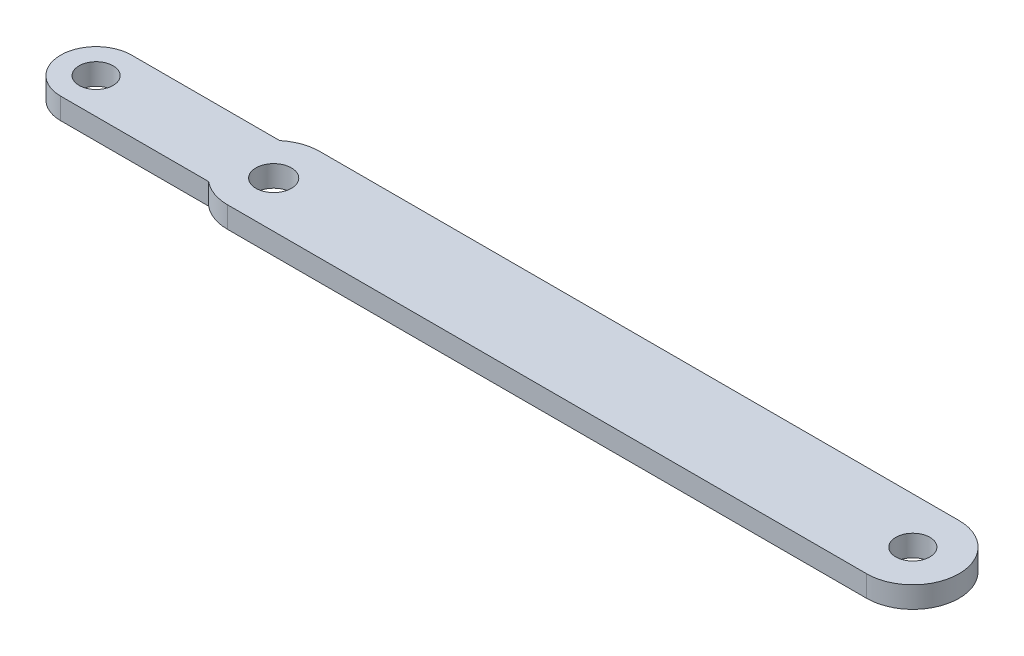
ISO-10303-21;
HEADER;
FILE_DESCRIPTION(('STEP AP214'),'2;1');
FILE_NAME('part.step','',(''),(''),'','','');
FILE_SCHEMA(('AUTOMOTIVE_DESIGN { 1 0 10303 214 1 1 1 1 }'));
ENDSEC;
DATA;
#1=APPLICATION_CONTEXT('core data for automotive mechanical design processes');
#2=APPLICATION_PROTOCOL_DEFINITION('international standard','automotive_design',2000,#1);
#3=PRODUCT_CONTEXT('',#1,'mechanical');
#4=PRODUCT('Part','Part','',(#3));
#5=PRODUCT_RELATED_PRODUCT_CATEGORY('part','',(#4));
#6=PRODUCT_DEFINITION_FORMATION('','',#4);
#7=PRODUCT_DEFINITION_CONTEXT('part definition',#1,'design');
#8=PRODUCT_DEFINITION('design','',#6,#7);
#9=PRODUCT_DEFINITION_SHAPE('','',#8);
#10=(LENGTH_UNIT() NAMED_UNIT(*) SI_UNIT(.MILLI.,.METRE.));
#11=(NAMED_UNIT(*) PLANE_ANGLE_UNIT() SI_UNIT($,.RADIAN.));
#12=(NAMED_UNIT(*) SI_UNIT($,.STERADIAN.) SOLID_ANGLE_UNIT());
#13=UNCERTAINTY_MEASURE_WITH_UNIT(LENGTH_MEASURE(1.E-05),#10,'distance_accuracy_value','');
#14=(GEOMETRIC_REPRESENTATION_CONTEXT(3) GLOBAL_UNCERTAINTY_ASSIGNED_CONTEXT((#13)) GLOBAL_UNIT_ASSIGNED_CONTEXT((#10,
#11,#12)) REPRESENTATION_CONTEXT('',''));
#15=CARTESIAN_POINT('',(0.,0.,0.));
#16=DIRECTION('',(0.,0.,1.));
#17=DIRECTION('',(1.,0.,0.));
#18=AXIS2_PLACEMENT_3D('',#15,#16,#17);
#19=CARTESIAN_POINT('',(0.,3.,-197.318492307149));
#20=DIRECTION('',(0.,0.,1.));
#21=DIRECTION('',(1.,0.,0.));
#22=AXIS2_PLACEMENT_3D('',#19,#20,#21);
#23=PLANE('',#22);
#24=DIRECTION('',(-1.,0.,0.));
#25=VECTOR('',#24,1.);
#26=CARTESIAN_POINT('',(0.,0.,-197.318492307149));
#27=LINE('',#26,#25);
#28=CARTESIAN_POINT('',(-6.55968882687473,0.,-197.318492307149));
#29=VERTEX_POINT('',#28);
#30=CARTESIAN_POINT('',(-27.4063768954157,0.,-197.318492307149));
#31=VERTEX_POINT('',#30);
#32=EDGE_CURVE('E147',#29,#31,#27,.T.);
#33=ORIENTED_EDGE('',*,*,#32,.T.);
#34=DIRECTION('',(0.,-1.,0.));
#35=VECTOR('',#34,1.);
#36=CARTESIAN_POINT('',(-27.4063768954157,3.,-197.318492307149));
#37=LINE('',#36,#35);
#38=CARTESIAN_POINT('',(-27.4063768954157,3.,-197.318492307149));
#39=VERTEX_POINT('',#38);
#40=EDGE_CURVE('E11',#39,#31,#37,.T.);
#41=ORIENTED_EDGE('',*,*,#40,.F.);
#42=DIRECTION('',(-1.,0.,0.));
#43=VECTOR('',#42,1.);
#44=CARTESIAN_POINT('',(0.,3.,-197.318492307149));
#45=LINE('',#44,#43);
#46=CARTESIAN_POINT('',(-6.55968882687473,3.,-197.318492307149));
#47=VERTEX_POINT('',#46);
#48=EDGE_CURVE('E201',#47,#39,#45,.T.);
#49=ORIENTED_EDGE('',*,*,#48,.F.);
#50=DIRECTION('',(0.,-1.,0.));
#51=VECTOR('',#50,1.);
#52=CARTESIAN_POINT('',(-6.55968882687473,3.,-197.318492307149));
#53=LINE('',#52,#51);
#54=EDGE_CURVE('E143',#47,#29,#53,.T.);
#55=ORIENTED_EDGE('',*,*,#54,.T.);
#56=EDGE_LOOP('',(#33,#41,#49,#55));
#57=FACE_BOUND('',#56,.T.);
#58=ADVANCED_FACE('F41',(#57),#23,.F.);
#59=CARTESIAN_POINT('',(-27.4063768954157,3.,-192.318492307149));
#60=DIRECTION('',(0.,-1.,0.));
#61=DIRECTION('',(0.,0.,-1.));
#62=AXIS2_PLACEMENT_3D('',#59,#60,#61);
#63=CYLINDRICAL_SURFACE('',#62,5.);
#64=CARTESIAN_POINT('',(-27.4063768954157,0.,-192.318492307149));
#65=DIRECTION('',(0.,1.,0.));
#66=DIRECTION('',(0.,0.,1.));
#67=AXIS2_PLACEMENT_3D('',#64,#65,#66);
#68=CIRCLE('',#67,5.);
#69=CARTESIAN_POINT('',(-27.4063768954157,0.,-187.318492307149));
#70=VERTEX_POINT('',#69);
#71=EDGE_CURVE('E150',#31,#70,#68,.T.);
#72=ORIENTED_EDGE('',*,*,#71,.T.);
#73=DIRECTION('',(0.,-1.,0.));
#74=VECTOR('',#73,1.);
#75=CARTESIAN_POINT('',(-27.4063768954157,3.,-187.318492307149));
#76=LINE('',#75,#74);
#77=CARTESIAN_POINT('',(-27.4063768954157,3.,-187.318492307149));
#78=VERTEX_POINT('',#77);
#79=EDGE_CURVE('E50',#78,#70,#76,.T.);
#80=ORIENTED_EDGE('',*,*,#79,.F.);
#81=CARTESIAN_POINT('',(-27.4063768954157,3.,-192.318492307149));
#82=DIRECTION('',(0.,1.,0.));
#83=DIRECTION('',(0.,0.,1.));
#84=AXIS2_PLACEMENT_3D('',#81,#82,#83);
#85=CIRCLE('',#84,5.);
#86=EDGE_CURVE('E97',#39,#78,#85,.T.);
#87=ORIENTED_EDGE('',*,*,#86,.F.);
#88=ORIENTED_EDGE('',*,*,#40,.T.);
#89=EDGE_LOOP('',(#72,#80,#87,#88));
#90=FACE_BOUND('',#89,.T.);
#91=ADVANCED_FACE('F184',(#90),#63,.T.);
#92=CARTESIAN_POINT('',(0.,3.,-187.318492307149));
#93=DIRECTION('',(0.,0.,1.));
#94=DIRECTION('',(1.,0.,0.));
#95=AXIS2_PLACEMENT_3D('',#92,#93,#94);
#96=PLANE('',#95);
#97=DIRECTION('',(-1.,0.,0.));
#98=VECTOR('',#97,1.);
#99=CARTESIAN_POINT('',(0.,0.,-187.318492307149));
#100=LINE('',#99,#98);
#101=CARTESIAN_POINT('',(-6.55968882687473,0.,-187.318492307149));
#102=VERTEX_POINT('',#101);
#103=EDGE_CURVE('E153',#102,#70,#100,.T.);
#104=ORIENTED_EDGE('',*,*,#103,.F.);
#105=DIRECTION('',(0.,-1.,0.));
#106=VECTOR('',#105,1.);
#107=CARTESIAN_POINT('',(-6.55968882687473,3.,-187.318492307149));
#108=LINE('',#107,#106);
#109=CARTESIAN_POINT('',(-6.55968882687473,3.,-187.318492307149));
#110=VERTEX_POINT('',#109);
#111=EDGE_CURVE('E177',#110,#102,#108,.T.);
#112=ORIENTED_EDGE('',*,*,#111,.F.);
#113=DIRECTION('',(-1.,0.,0.));
#114=VECTOR('',#113,1.);
#115=CARTESIAN_POINT('',(0.,3.,-187.318492307149));
#116=LINE('',#115,#114);
#117=EDGE_CURVE('E183',#110,#78,#116,.T.);
#118=ORIENTED_EDGE('',*,*,#117,.T.);
#119=ORIENTED_EDGE('',*,*,#79,.T.);
#120=EDGE_LOOP('',(#104,#112,#118,#119));
#121=FACE_BOUND('',#120,.T.);
#122=ADVANCED_FACE('F181',(#121),#96,.T.);
#123=CARTESIAN_POINT('',(-2.40637689541569,3.,-192.318492307149));
#124=DIRECTION('',(0.,-1.,0.));
#125=DIRECTION('',(0.,0.,-1.));
#126=AXIS2_PLACEMENT_3D('',#123,#124,#125);
#127=CYLINDRICAL_SURFACE('',#126,6.50000000000001);
#128=CARTESIAN_POINT('',(-2.40637689541569,0.,-192.318492307149));
#129=DIRECTION('',(0.,1.,0.));
#130=DIRECTION('',(0.,0.,1.));
#131=AXIS2_PLACEMENT_3D('',#128,#129,#130);
#132=CIRCLE('',#131,6.50000000000001);
#133=CARTESIAN_POINT('',(-2.40637689541569,0.,-185.818492307149));
#134=VERTEX_POINT('',#133);
#135=EDGE_CURVE('E156',#102,#134,#132,.T.);
#136=ORIENTED_EDGE('',*,*,#135,.T.);
#137=DIRECTION('',(0.,-1.,0.));
#138=VECTOR('',#137,1.);
#139=CARTESIAN_POINT('',(-2.40637689541569,3.,-185.818492307149));
#140=LINE('',#139,#138);
#141=CARTESIAN_POINT('',(-2.40637689541569,3.,-185.818492307149));
#142=VERTEX_POINT('',#141);
#143=EDGE_CURVE('E174',#142,#134,#140,.T.);
#144=ORIENTED_EDGE('',*,*,#143,.F.);
#145=CARTESIAN_POINT('',(-2.40637689541569,3.,-192.318492307149));
#146=DIRECTION('',(0.,1.,0.));
#147=DIRECTION('',(0.,0.,1.));
#148=AXIS2_PLACEMENT_3D('',#145,#146,#147);
#149=CIRCLE('',#148,6.50000000000001);
#150=EDGE_CURVE('E135',#110,#142,#149,.T.);
#151=ORIENTED_EDGE('',*,*,#150,.F.);
#152=ORIENTED_EDGE('',*,*,#111,.T.);
#153=EDGE_LOOP('',(#136,#144,#151,#152));
#154=FACE_BOUND('',#153,.T.);
#155=ADVANCED_FACE('F194',(#154),#127,.T.);
#156=CARTESIAN_POINT('',(0.,3.,-185.818492307149));
#157=DIRECTION('',(0.,0.,-1.));
#158=DIRECTION('',(-1.,0.,0.));
#159=AXIS2_PLACEMENT_3D('',#156,#157,#158);
#160=PLANE('',#159);
#161=DIRECTION('',(1.,0.,0.));
#162=VECTOR('',#161,1.);
#163=CARTESIAN_POINT('',(0.,0.,-185.818492307149));
#164=LINE('',#163,#162);
#165=CARTESIAN_POINT('',(87.5936231045843,0.,-185.818492307149));
#166=VERTEX_POINT('',#165);
#167=EDGE_CURVE('E158',#134,#166,#164,.T.);
#168=ORIENTED_EDGE('',*,*,#167,.T.);
#169=DIRECTION('',(0.,-1.,0.));
#170=VECTOR('',#169,1.);
#171=CARTESIAN_POINT('',(87.5936231045843,3.,-185.818492307149));
#172=LINE('',#171,#170);
#173=CARTESIAN_POINT('',(87.5936231045843,3.,-185.818492307149));
#174=VERTEX_POINT('',#173);
#175=EDGE_CURVE('E122',#174,#166,#172,.T.);
#176=ORIENTED_EDGE('',*,*,#175,.F.);
#177=DIRECTION('',(1.,0.,0.));
#178=VECTOR('',#177,1.);
#179=CARTESIAN_POINT('',(0.,3.,-185.818492307149));
#180=LINE('',#179,#178);
#181=EDGE_CURVE('E128',#142,#174,#180,.T.);
#182=ORIENTED_EDGE('',*,*,#181,.F.);
#183=ORIENTED_EDGE('',*,*,#143,.T.);
#184=EDGE_LOOP('',(#168,#176,#182,#183));
#185=FACE_BOUND('',#184,.T.);
#186=ADVANCED_FACE('F197',(#185),#160,.F.);
#187=CARTESIAN_POINT('',(87.5936231045843,3.,-192.318492307149));
#188=DIRECTION('',(0.,-1.,0.));
#189=DIRECTION('',(0.,0.,-1.));
#190=AXIS2_PLACEMENT_3D('',#187,#188,#189);
#191=CYLINDRICAL_SURFACE('',#190,6.50000000000001);
#192=CARTESIAN_POINT('',(87.5936231045843,0.,-192.318492307149));
#193=DIRECTION('',(0.,1.,0.));
#194=DIRECTION('',(0.,0.,1.));
#195=AXIS2_PLACEMENT_3D('',#192,#193,#194);
#196=CIRCLE('',#195,6.50000000000001);
#197=CARTESIAN_POINT('',(87.5936231045843,0.,-198.818492307149));
#198=VERTEX_POINT('',#197);
#199=EDGE_CURVE('E117',#198,#166,#196,.F.);
#200=ORIENTED_EDGE('',*,*,#199,.F.);
#201=DIRECTION('',(0.,-1.,0.));
#202=VECTOR('',#201,1.);
#203=CARTESIAN_POINT('',(87.5936231045843,3.,-198.818492307149));
#204=LINE('',#203,#202);
#205=CARTESIAN_POINT('',(87.5936231045843,3.,-198.818492307149));
#206=VERTEX_POINT('',#205);
#207=EDGE_CURVE('E112',#206,#198,#204,.T.);
#208=ORIENTED_EDGE('',*,*,#207,.F.);
#209=CARTESIAN_POINT('',(87.5936231045843,3.,-192.318492307149));
#210=DIRECTION('',(0.,1.,0.));
#211=DIRECTION('',(0.,0.,1.));
#212=AXIS2_PLACEMENT_3D('',#209,#210,#211);
#213=CIRCLE('',#212,6.50000000000001);
#214=EDGE_CURVE('E115',#206,#174,#213,.F.);
#215=ORIENTED_EDGE('',*,*,#214,.T.);
#216=ORIENTED_EDGE('',*,*,#175,.T.);
#217=EDGE_LOOP('',(#200,#208,#215,#216));
#218=FACE_BOUND('',#217,.T.);
#219=ADVANCED_FACE('F114',(#218),#191,.T.);
#220=CARTESIAN_POINT('',(0.,3.,-198.818492307149));
#221=DIRECTION('',(0.,0.,-1.));
#222=DIRECTION('',(-1.,0.,0.));
#223=AXIS2_PLACEMENT_3D('',#220,#221,#222);
#224=PLANE('',#223);
#225=DIRECTION('',(1.,0.,0.));
#226=VECTOR('',#225,1.);
#227=CARTESIAN_POINT('',(0.,0.,-198.818492307149));
#228=LINE('',#227,#226);
#229=CARTESIAN_POINT('',(-2.40637689541569,0.,-198.818492307149));
#230=VERTEX_POINT('',#229);
#231=EDGE_CURVE('E162',#230,#198,#228,.T.);
#232=ORIENTED_EDGE('',*,*,#231,.F.);
#233=DIRECTION('',(0.,-1.,0.));
#234=VECTOR('',#233,1.);
#235=CARTESIAN_POINT('',(-2.40637689541569,3.,-198.818492307149));
#236=LINE('',#235,#234);
#237=CARTESIAN_POINT('',(-2.40637689541569,3.,-198.818492307149));
#238=VERTEX_POINT('',#237);
#239=EDGE_CURVE('E86',#238,#230,#236,.T.);
#240=ORIENTED_EDGE('',*,*,#239,.F.);
#241=DIRECTION('',(1.,0.,0.));
#242=VECTOR('',#241,1.);
#243=CARTESIAN_POINT('',(0.,3.,-198.818492307149));
#244=LINE('',#243,#242);
#245=EDGE_CURVE('E126',#238,#206,#244,.T.);
#246=ORIENTED_EDGE('',*,*,#245,.T.);
#247=ORIENTED_EDGE('',*,*,#207,.T.);
#248=EDGE_LOOP('',(#232,#240,#246,#247));
#249=FACE_BOUND('',#248,.T.);
#250=ADVANCED_FACE('F131',(#249),#224,.T.);
#251=CARTESIAN_POINT('',(-2.40637689541569,3.,-192.318492307149));
#252=DIRECTION('',(0.,-1.,0.));
#253=DIRECTION('',(0.,0.,-1.));
#254=AXIS2_PLACEMENT_3D('',#251,#252,#253);
#255=CYLINDRICAL_SURFACE('',#254,2.5);
#256=CARTESIAN_POINT('',(-2.40637689541569,3.,-192.318492307149));
#257=DIRECTION('',(0.,1.,0.));
#258=DIRECTION('',(0.,0.,1.));
#259=AXIS2_PLACEMENT_3D('',#256,#257,#258);
#260=CIRCLE('',#259,2.5);
#261=CARTESIAN_POINT('',(-2.40637689541569,3.,-189.818492307149));
#262=VERTEX_POINT('',#261);
#263=EDGE_CURVE('E133',#262,#262,#260,.T.);
#264=ORIENTED_EDGE('',*,*,#263,.T.);
#265=EDGE_LOOP('',(#264));
#266=FACE_BOUND('',#265,.T.);
#267=CARTESIAN_POINT('',(-2.40637689541569,0.,-192.318492307149));
#268=DIRECTION('',(0.,1.,0.));
#269=DIRECTION('',(0.,0.,1.));
#270=AXIS2_PLACEMENT_3D('',#267,#268,#269);
#271=CIRCLE('',#270,2.5);
#272=CARTESIAN_POINT('',(-2.40637689541569,0.,-189.818492307149));
#273=VERTEX_POINT('',#272);
#274=EDGE_CURVE('E164',#273,#273,#271,.T.);
#275=ORIENTED_EDGE('',*,*,#274,.F.);
#276=EDGE_LOOP('',(#275));
#277=FACE_BOUND('',#276,.T.);
#278=ADVANCED_FACE('F234',(#266,#277),#255,.F.);
#279=EDGE_CURVE('E89',#230,#29,#132,.T.);
#280=ORIENTED_EDGE('',*,*,#279,.T.);
#281=ORIENTED_EDGE('',*,*,#54,.F.);
#282=EDGE_CURVE('E58',#238,#47,#149,.T.);
#283=ORIENTED_EDGE('',*,*,#282,.F.);
#284=ORIENTED_EDGE('',*,*,#239,.T.);
#285=EDGE_LOOP('',(#280,#281,#283,#284));
#286=FACE_BOUND('',#285,.T.);
#287=ADVANCED_FACE('F235',(#286),#127,.T.);
#288=CARTESIAN_POINT('',(-27.4063768954157,3.,-192.318492307149));
#289=DIRECTION('',(0.,-1.,0.));
#290=DIRECTION('',(0.,0.,-1.));
#291=AXIS2_PLACEMENT_3D('',#288,#289,#290);
#292=CYLINDRICAL_SURFACE('',#291,2.4);
#293=CARTESIAN_POINT('',(-27.4063768954157,3.,-192.318492307149));
#294=DIRECTION('',(0.,1.,0.));
#295=DIRECTION('',(0.,0.,1.));
#296=AXIS2_PLACEMENT_3D('',#293,#294,#295);
#297=CIRCLE('',#296,2.4);
#298=CARTESIAN_POINT('',(-27.4063768954157,3.,-189.918492307149));
#299=VERTEX_POINT('',#298);
#300=EDGE_CURVE('E170',#299,#299,#297,.T.);
#301=ORIENTED_EDGE('',*,*,#300,.T.);
#302=EDGE_LOOP('',(#301));
#303=FACE_BOUND('',#302,.T.);
#304=CARTESIAN_POINT('',(-27.4063768954157,0.,-192.318492307149));
#305=DIRECTION('',(0.,1.,0.));
#306=DIRECTION('',(0.,0.,1.));
#307=AXIS2_PLACEMENT_3D('',#304,#305,#306);
#308=CIRCLE('',#307,2.4);
#309=CARTESIAN_POINT('',(-27.4063768954157,0.,-189.918492307149));
#310=VERTEX_POINT('',#309);
#311=EDGE_CURVE('E144',#310,#310,#308,.T.);
#312=ORIENTED_EDGE('',*,*,#311,.F.);
#313=EDGE_LOOP('',(#312));
#314=FACE_BOUND('',#313,.T.);
#315=ADVANCED_FACE('F43',(#303,#314),#292,.F.);
#316=CARTESIAN_POINT('',(87.5936231045843,3.,-192.318492307149));
#317=DIRECTION('',(0.,-1.,0.));
#318=DIRECTION('',(0.,0.,-1.));
#319=AXIS2_PLACEMENT_3D('',#316,#317,#318);
#320=CYLINDRICAL_SURFACE('',#319,2.4);
#321=CARTESIAN_POINT('',(87.5936231045843,3.,-192.318492307149));
#322=DIRECTION('',(0.,1.,0.));
#323=DIRECTION('',(0.,0.,1.));
#324=AXIS2_PLACEMENT_3D('',#321,#322,#323);
#325=CIRCLE('',#324,2.4);
#326=CARTESIAN_POINT('',(87.5936231045843,3.,-189.918492307149));
#327=VERTEX_POINT('',#326);
#328=EDGE_CURVE('E140',#327,#327,#325,.T.);
#329=ORIENTED_EDGE('',*,*,#328,.T.);
#330=EDGE_LOOP('',(#329));
#331=FACE_BOUND('',#330,.T.);
#332=CARTESIAN_POINT('',(87.5936231045843,0.,-192.318492307149));
#333=DIRECTION('',(0.,1.,0.));
#334=DIRECTION('',(0.,0.,1.));
#335=AXIS2_PLACEMENT_3D('',#332,#333,#334);
#336=CIRCLE('',#335,2.4);
#337=CARTESIAN_POINT('',(87.5936231045843,0.,-189.918492307149));
#338=VERTEX_POINT('',#337);
#339=EDGE_CURVE('E167',#338,#338,#336,.T.);
#340=ORIENTED_EDGE('',*,*,#339,.F.);
#341=EDGE_LOOP('',(#340));
#342=FACE_BOUND('',#341,.T.);
#343=ADVANCED_FACE('F209',(#331,#342),#320,.F.);
#344=CARTESIAN_POINT('',(0.,3.,0.));
#345=DIRECTION('',(0.,1.,0.));
#346=DIRECTION('',(0.,0.,1.));
#347=AXIS2_PLACEMENT_3D('',#344,#345,#346);
#348=PLANE('',#347);
#349=ORIENTED_EDGE('',*,*,#300,.F.);
#350=EDGE_LOOP('',(#349));
#351=FACE_BOUND('',#350,.T.);
#352=ORIENTED_EDGE('',*,*,#48,.T.);
#353=ORIENTED_EDGE('',*,*,#86,.T.);
#354=ORIENTED_EDGE('',*,*,#117,.F.);
#355=ORIENTED_EDGE('',*,*,#150,.T.);
#356=ORIENTED_EDGE('',*,*,#181,.T.);
#357=ORIENTED_EDGE('',*,*,#214,.F.);
#358=ORIENTED_EDGE('',*,*,#245,.F.);
#359=ORIENTED_EDGE('',*,*,#282,.T.);
#360=EDGE_LOOP('',(#352,#353,#354,#355,#356,#357,#358,#359));
#361=FACE_BOUND('',#360,.T.);
#362=ORIENTED_EDGE('',*,*,#263,.F.);
#363=EDGE_LOOP('',(#362));
#364=FACE_BOUND('',#363,.T.);
#365=ORIENTED_EDGE('',*,*,#328,.F.);
#366=EDGE_LOOP('',(#365));
#367=FACE_BOUND('',#366,.T.);
#368=ADVANCED_FACE('F124',(#351,#361,#364,#367),#348,.T.);
#369=CARTESIAN_POINT('',(0.,0.,0.));
#370=DIRECTION('',(0.,1.,0.));
#371=DIRECTION('',(0.,0.,1.));
#372=AXIS2_PLACEMENT_3D('',#369,#370,#371);
#373=PLANE('',#372);
#374=ORIENTED_EDGE('',*,*,#311,.T.);
#375=EDGE_LOOP('',(#374));
#376=FACE_BOUND('',#375,.T.);
#377=ORIENTED_EDGE('',*,*,#32,.F.);
#378=ORIENTED_EDGE('',*,*,#279,.F.);
#379=ORIENTED_EDGE('',*,*,#231,.T.);
#380=ORIENTED_EDGE('',*,*,#199,.T.);
#381=ORIENTED_EDGE('',*,*,#167,.F.);
#382=ORIENTED_EDGE('',*,*,#135,.F.);
#383=ORIENTED_EDGE('',*,*,#103,.T.);
#384=ORIENTED_EDGE('',*,*,#71,.F.);
#385=EDGE_LOOP('',(#377,#378,#379,#380,#381,#382,#383,#384));
#386=FACE_BOUND('',#385,.T.);
#387=ORIENTED_EDGE('',*,*,#274,.T.);
#388=EDGE_LOOP('',(#387));
#389=FACE_BOUND('',#388,.T.);
#390=ORIENTED_EDGE('',*,*,#339,.T.);
#391=EDGE_LOOP('',(#390));
#392=FACE_BOUND('',#391,.T.);
#393=ADVANCED_FACE('F189',(#376,#386,#389,#392),#373,.F.);
#394=CLOSED_SHELL('',(#58,#91,#122,#155,#186,#219,#250,#278,#287,#315,#343,#368,#393));
#395=MANIFOLD_SOLID_BREP('B2',#394);
#396=ADVANCED_BREP_SHAPE_REPRESENTATION('',(#18,#395),#14);
#397=SHAPE_DEFINITION_REPRESENTATION(#9,#396);
ENDSEC;
END-ISO-10303-21;
